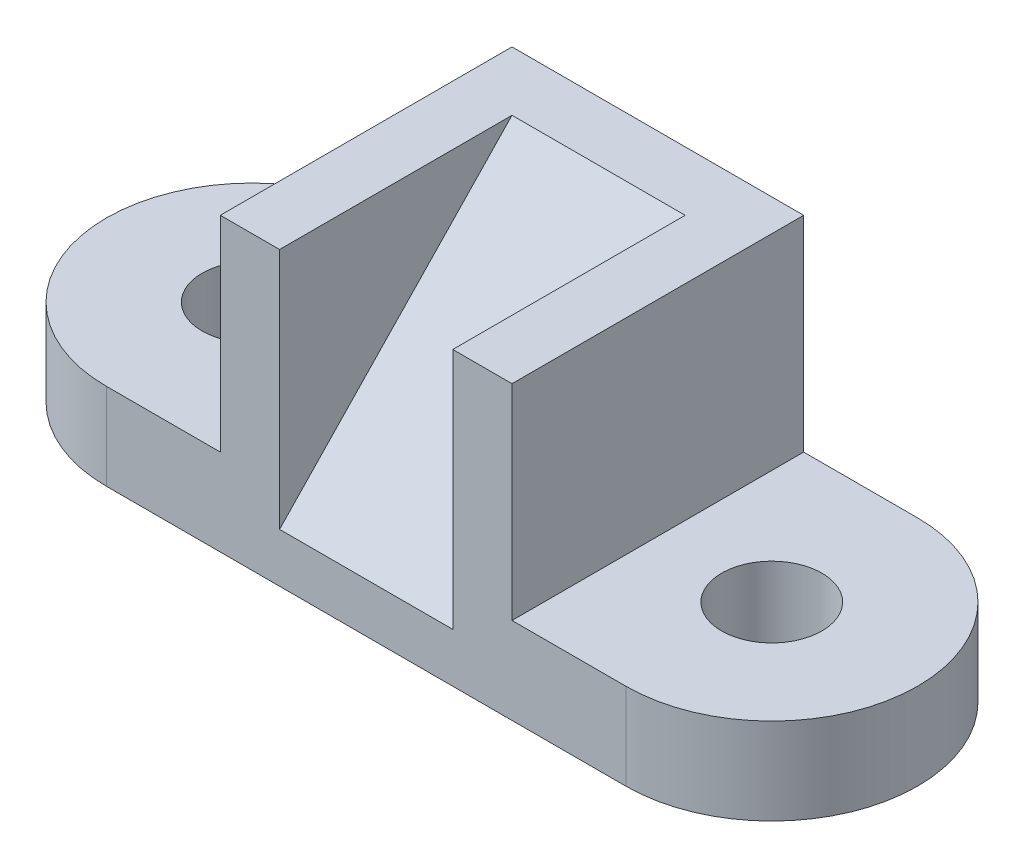
ISO-10303-21;
HEADER;
FILE_DESCRIPTION(('STEP AP214'),'2;1');
FILE_NAME('part.step','',(''),(''),'','','');
FILE_SCHEMA(('AUTOMOTIVE_DESIGN { 1 0 10303 214 1 1 1 1 }'));
ENDSEC;
DATA;
#1=APPLICATION_CONTEXT('core data for automotive mechanical design processes');
#2=APPLICATION_PROTOCOL_DEFINITION('international standard','automotive_design',2000,#1);
#3=PRODUCT_CONTEXT('',#1,'mechanical');
#4=PRODUCT('Part','Part','',(#3));
#5=PRODUCT_RELATED_PRODUCT_CATEGORY('part','',(#4));
#6=PRODUCT_DEFINITION_FORMATION('','',#4);
#7=PRODUCT_DEFINITION_CONTEXT('part definition',#1,'design');
#8=PRODUCT_DEFINITION('design','',#6,#7);
#9=PRODUCT_DEFINITION_SHAPE('','',#8);
#10=(LENGTH_UNIT() NAMED_UNIT(*) SI_UNIT(.MILLI.,.METRE.));
#11=(NAMED_UNIT(*) PLANE_ANGLE_UNIT() SI_UNIT($,.RADIAN.));
#12=(NAMED_UNIT(*) SI_UNIT($,.STERADIAN.) SOLID_ANGLE_UNIT());
#13=UNCERTAINTY_MEASURE_WITH_UNIT(LENGTH_MEASURE(1.E-05),#10,'distance_accuracy_value','');
#14=(GEOMETRIC_REPRESENTATION_CONTEXT(3) GLOBAL_UNCERTAINTY_ASSIGNED_CONTEXT((#13)) GLOBAL_UNIT_ASSIGNED_CONTEXT((#10,
#11,#12)) REPRESENTATION_CONTEXT('',''));
#15=CARTESIAN_POINT('',(0.,0.,0.));
#16=DIRECTION('',(0.,0.,1.));
#17=DIRECTION('',(1.,0.,0.));
#18=AXIS2_PLACEMENT_3D('',#15,#16,#17);
#19=CARTESIAN_POINT('',(-57.,19.,32.));
#20=DIRECTION('',(0.,0.,-1.));
#21=DIRECTION('',(-1.,0.,0.));
#22=AXIS2_PLACEMENT_3D('',#19,#20,#21);
#23=PLANE('',#22);
#24=DIRECTION('',(0.,1.,0.));
#25=VECTOR('',#24,1.);
#26=CARTESIAN_POINT('',(19.,10.8133361636676,32.));
#27=LINE('',#26,#25);
#28=CARTESIAN_POINT('',(19.,10.8133361636676,32.));
#29=VERTEX_POINT('',#28);
#30=CARTESIAN_POINT('',(19.,64.,32.));
#31=VERTEX_POINT('',#30);
#32=EDGE_CURVE('E124',#29,#31,#27,.T.);
#33=ORIENTED_EDGE('',*,*,#32,.F.);
#34=DIRECTION('',(-1.,0.,0.));
#35=VECTOR('',#34,1.);
#36=CARTESIAN_POINT('',(19.,10.8133361636676,32.));
#37=LINE('',#36,#35);
#38=CARTESIAN_POINT('',(-19.,10.8133361636676,32.));
#39=VERTEX_POINT('',#38);
#40=EDGE_CURVE('E160',#29,#39,#37,.T.);
#41=ORIENTED_EDGE('',*,*,#40,.T.);
#42=DIRECTION('',(0.,1.,0.));
#43=VECTOR('',#42,1.);
#44=CARTESIAN_POINT('',(-19.,10.8133361636676,32.));
#45=LINE('',#44,#43);
#46=CARTESIAN_POINT('',(-19.,64.,32.));
#47=VERTEX_POINT('',#46);
#48=EDGE_CURVE('E359',#39,#47,#45,.T.);
#49=ORIENTED_EDGE('',*,*,#48,.T.);
#50=DIRECTION('',(1.,0.,0.));
#51=VECTOR('',#50,1.);
#52=CARTESIAN_POINT('',(-32.,64.,32.));
#53=LINE('',#52,#51);
#54=CARTESIAN_POINT('',(-32.,64.,32.));
#55=VERTEX_POINT('',#54);
#56=EDGE_CURVE('E143',#55,#47,#53,.T.);
#57=ORIENTED_EDGE('',*,*,#56,.F.);
#58=DIRECTION('',(0.,-1.,0.));
#59=VECTOR('',#58,1.);
#60=CARTESIAN_POINT('',(-32.,64.,32.));
#61=LINE('',#60,#59);
#62=CARTESIAN_POINT('',(-32.,19.,32.));
#63=VERTEX_POINT('',#62);
#64=EDGE_CURVE('E159',#55,#63,#61,.T.);
#65=ORIENTED_EDGE('',*,*,#64,.T.);
#66=DIRECTION('',(1.,0.,0.));
#67=VECTOR('',#66,1.);
#68=CARTESIAN_POINT('',(-57.,19.,32.));
#69=LINE('',#68,#67);
#70=CARTESIAN_POINT('',(-57.,19.,32.));
#71=VERTEX_POINT('',#70);
#72=EDGE_CURVE('E187',#71,#63,#69,.T.);
#73=ORIENTED_EDGE('',*,*,#72,.F.);
#74=DIRECTION('',(0.,-1.,0.));
#75=VECTOR('',#74,1.);
#76=CARTESIAN_POINT('',(-57.,19.,32.));
#77=LINE('',#76,#75);
#78=CARTESIAN_POINT('',(-57.,0.,32.));
#79=VERTEX_POINT('',#78);
#80=EDGE_CURVE('E11',#71,#79,#77,.T.);
#81=ORIENTED_EDGE('',*,*,#80,.T.);
#82=DIRECTION('',(1.,0.,0.));
#83=VECTOR('',#82,1.);
#84=CARTESIAN_POINT('',(-57.,0.,32.));
#85=LINE('',#84,#83);
#86=CARTESIAN_POINT('',(57.,0.,32.));
#87=VERTEX_POINT('',#86);
#88=EDGE_CURVE('E199',#79,#87,#85,.T.);
#89=ORIENTED_EDGE('',*,*,#88,.T.);
#90=DIRECTION('',(0.,-1.,0.));
#91=VECTOR('',#90,1.);
#92=CARTESIAN_POINT('',(57.,19.,32.));
#93=LINE('',#92,#91);
#94=CARTESIAN_POINT('',(57.,19.,32.));
#95=VERTEX_POINT('',#94);
#96=EDGE_CURVE('E47',#95,#87,#93,.T.);
#97=ORIENTED_EDGE('',*,*,#96,.F.);
#98=CARTESIAN_POINT('',(32.,19.,32.));
#99=VERTEX_POINT('',#98);
#100=EDGE_CURVE('E185',#99,#95,#69,.T.);
#101=ORIENTED_EDGE('',*,*,#100,.F.);
#102=DIRECTION('',(0.,-1.,0.));
#103=VECTOR('',#102,1.);
#104=CARTESIAN_POINT('',(32.,64.,32.));
#105=LINE('',#104,#103);
#106=CARTESIAN_POINT('',(32.,64.,32.));
#107=VERTEX_POINT('',#106);
#108=EDGE_CURVE('E62',#107,#99,#105,.T.);
#109=ORIENTED_EDGE('',*,*,#108,.F.);
#110=EDGE_CURVE('E138',#31,#107,#53,.T.);
#111=ORIENTED_EDGE('',*,*,#110,.F.);
#112=EDGE_LOOP('',(#33,#41,#49,#57,#65,#73,#81,#89,#97,#101,#109,#111));
#113=FACE_BOUND('',#112,.T.);
#114=ADVANCED_FACE('F39',(#113),#23,.F.);
#115=CARTESIAN_POINT('',(0.,64.,0.));
#116=DIRECTION('',(0.,-1.,0.));
#117=DIRECTION('',(0.,0.,-1.));
#118=AXIS2_PLACEMENT_3D('',#115,#116,#117);
#119=PLANE('',#118);
#120=DIRECTION('',(0.,0.,-1.));
#121=VECTOR('',#120,1.);
#122=CARTESIAN_POINT('',(19.,64.,32.));
#123=LINE('',#122,#121);
#124=CARTESIAN_POINT('',(19.,64.,-19.));
#125=VERTEX_POINT('',#124);
#126=EDGE_CURVE('E127',#31,#125,#123,.T.);
#127=ORIENTED_EDGE('',*,*,#126,.F.);
#128=ORIENTED_EDGE('',*,*,#110,.T.);
#129=DIRECTION('',(0.,0.,1.));
#130=VECTOR('',#129,1.);
#131=CARTESIAN_POINT('',(32.,64.,-32.));
#132=LINE('',#131,#130);
#133=CARTESIAN_POINT('',(32.,64.,-32.));
#134=VERTEX_POINT('',#133);
#135=EDGE_CURVE('E147',#134,#107,#132,.T.);
#136=ORIENTED_EDGE('',*,*,#135,.F.);
#137=DIRECTION('',(1.,0.,0.));
#138=VECTOR('',#137,1.);
#139=CARTESIAN_POINT('',(-32.,64.,-32.));
#140=LINE('',#139,#138);
#141=CARTESIAN_POINT('',(-32.,64.,-32.));
#142=VERTEX_POINT('',#141);
#143=EDGE_CURVE('E154',#142,#134,#140,.T.);
#144=ORIENTED_EDGE('',*,*,#143,.F.);
#145=DIRECTION('',(0.,0.,1.));
#146=VECTOR('',#145,1.);
#147=CARTESIAN_POINT('',(-32.,64.,-32.));
#148=LINE('',#147,#146);
#149=EDGE_CURVE('E157',#142,#55,#148,.T.);
#150=ORIENTED_EDGE('',*,*,#149,.T.);
#151=ORIENTED_EDGE('',*,*,#56,.T.);
#152=DIRECTION('',(0.,0.,-1.));
#153=VECTOR('',#152,1.);
#154=CARTESIAN_POINT('',(-19.,64.,32.));
#155=LINE('',#154,#153);
#156=CARTESIAN_POINT('',(-19.,64.,-19.));
#157=VERTEX_POINT('',#156);
#158=EDGE_CURVE('E360',#47,#157,#155,.T.);
#159=ORIENTED_EDGE('',*,*,#158,.T.);
#160=DIRECTION('',(-1.,0.,0.));
#161=VECTOR('',#160,1.);
#162=CARTESIAN_POINT('',(19.,64.,-19.));
#163=LINE('',#162,#161);
#164=EDGE_CURVE('E140',#125,#157,#163,.T.);
#165=ORIENTED_EDGE('',*,*,#164,.F.);
#166=EDGE_LOOP('',(#127,#128,#136,#144,#150,#151,#159,#165));
#167=FACE_BOUND('',#166,.T.);
#168=ADVANCED_FACE('F136',(#167),#119,.F.);
#169=CARTESIAN_POINT('',(-57.,19.,0.));
#170=DIRECTION('',(0.,1.,0.));
#171=DIRECTION('',(0.,0.,1.));
#172=AXIS2_PLACEMENT_3D('',#169,#170,#171);
#173=PLANE('',#172);
#174=CARTESIAN_POINT('',(57.,19.,0.));
#175=DIRECTION('',(0.,1.,0.));
#176=DIRECTION('',(0.,0.,1.));
#177=AXIS2_PLACEMENT_3D('',#174,#175,#176);
#178=CIRCLE('',#177,11.);
#179=CARTESIAN_POINT('',(57.,19.,11.));
#180=VERTEX_POINT('',#179);
#181=EDGE_CURVE('E170',#180,#180,#178,.T.);
#182=ORIENTED_EDGE('',*,*,#181,.F.);
#183=EDGE_LOOP('',(#182));
#184=FACE_BOUND('',#183,.T.);
#185=DIRECTION('',(-1.,0.,0.));
#186=VECTOR('',#185,1.);
#187=CARTESIAN_POINT('',(-57.,19.,-32.));
#188=LINE('',#187,#186);
#189=CARTESIAN_POINT('',(57.,19.,-32.));
#190=VERTEX_POINT('',#189);
#191=CARTESIAN_POINT('',(32.,19.,-32.));
#192=VERTEX_POINT('',#191);
#193=EDGE_CURVE('E193',#190,#192,#188,.T.);
#194=ORIENTED_EDGE('',*,*,#193,.T.);
#195=DIRECTION('',(0.,0.,1.));
#196=VECTOR('',#195,1.);
#197=CARTESIAN_POINT('',(32.,19.,-32.));
#198=LINE('',#197,#196);
#199=EDGE_CURVE('E148',#192,#99,#198,.T.);
#200=ORIENTED_EDGE('',*,*,#199,.T.);
#201=ORIENTED_EDGE('',*,*,#100,.T.);
#202=CARTESIAN_POINT('',(57.,19.,0.));
#203=DIRECTION('',(0.,1.,0.));
#204=DIRECTION('',(0.,0.,1.));
#205=AXIS2_PLACEMENT_3D('',#202,#203,#204);
#206=CIRCLE('',#205,32.);
#207=EDGE_CURVE('E190',#95,#190,#206,.T.);
#208=ORIENTED_EDGE('',*,*,#207,.T.);
#209=EDGE_LOOP('',(#194,#200,#201,#208));
#210=FACE_BOUND('',#209,.T.);
#211=ADVANCED_FACE('F240',(#184,#210),#173,.T.);
#212=DIRECTION('',(0.,0.,1.));
#213=VECTOR('',#212,1.);
#214=CARTESIAN_POINT('',(-32.,19.,-32.));
#215=LINE('',#214,#213);
#216=CARTESIAN_POINT('',(-32.,19.,-32.));
#217=VERTEX_POINT('',#216);
#218=EDGE_CURVE('E144',#217,#63,#215,.T.);
#219=ORIENTED_EDGE('',*,*,#218,.F.);
#220=CARTESIAN_POINT('',(-57.,19.,-32.));
#221=VERTEX_POINT('',#220);
#222=EDGE_CURVE('E192',#217,#221,#188,.T.);
#223=ORIENTED_EDGE('',*,*,#222,.T.);
#224=CARTESIAN_POINT('',(-57.,19.,0.));
#225=DIRECTION('',(0.,1.,0.));
#226=DIRECTION('',(0.,0.,1.));
#227=AXIS2_PLACEMENT_3D('',#224,#225,#226);
#228=CIRCLE('',#227,32.);
#229=EDGE_CURVE('E182',#221,#71,#228,.T.);
#230=ORIENTED_EDGE('',*,*,#229,.T.);
#231=ORIENTED_EDGE('',*,*,#72,.T.);
#232=EDGE_LOOP('',(#219,#223,#230,#231));
#233=FACE_BOUND('',#232,.T.);
#234=CARTESIAN_POINT('',(-57.,19.,0.));
#235=DIRECTION('',(0.,1.,0.));
#236=DIRECTION('',(0.,0.,1.));
#237=AXIS2_PLACEMENT_3D('',#234,#235,#236);
#238=CIRCLE('',#237,11.);
#239=CARTESIAN_POINT('',(-57.,19.,11.));
#240=VERTEX_POINT('',#239);
#241=EDGE_CURVE('E176',#240,#240,#238,.T.);
#242=ORIENTED_EDGE('',*,*,#241,.F.);
#243=EDGE_LOOP('',(#242));
#244=FACE_BOUND('',#243,.T.);
#245=ADVANCED_FACE('F230',(#233,#244),#173,.T.);
#246=CARTESIAN_POINT('',(-57.,0.,0.));
#247=DIRECTION('',(0.,1.,0.));
#248=DIRECTION('',(0.,0.,1.));
#249=AXIS2_PLACEMENT_3D('',#246,#247,#248);
#250=PLANE('',#249);
#251=CARTESIAN_POINT('',(-57.,0.,0.));
#252=DIRECTION('',(0.,1.,0.));
#253=DIRECTION('',(0.,0.,1.));
#254=AXIS2_PLACEMENT_3D('',#251,#252,#253);
#255=CIRCLE('',#254,32.);
#256=CARTESIAN_POINT('',(-57.,0.,-32.));
#257=VERTEX_POINT('',#256);
#258=EDGE_CURVE('E179',#257,#79,#255,.T.);
#259=ORIENTED_EDGE('',*,*,#258,.F.);
#260=DIRECTION('',(-1.,0.,0.));
#261=VECTOR('',#260,1.);
#262=CARTESIAN_POINT('',(-57.,0.,-32.));
#263=LINE('',#262,#261);
#264=CARTESIAN_POINT('',(57.,0.,-32.));
#265=VERTEX_POINT('',#264);
#266=EDGE_CURVE('E186',#265,#257,#263,.T.);
#267=ORIENTED_EDGE('',*,*,#266,.F.);
#268=CARTESIAN_POINT('',(57.,0.,0.));
#269=DIRECTION('',(0.,1.,0.));
#270=DIRECTION('',(0.,0.,1.));
#271=AXIS2_PLACEMENT_3D('',#268,#269,#270);
#272=CIRCLE('',#271,32.);
#273=EDGE_CURVE('E201',#87,#265,#272,.T.);
#274=ORIENTED_EDGE('',*,*,#273,.F.);
#275=ORIENTED_EDGE('',*,*,#88,.F.);
#276=EDGE_LOOP('',(#259,#267,#274,#275));
#277=FACE_BOUND('',#276,.T.);
#278=CARTESIAN_POINT('',(-57.,0.,0.));
#279=DIRECTION('',(0.,1.,0.));
#280=DIRECTION('',(0.,0.,1.));
#281=AXIS2_PLACEMENT_3D('',#278,#279,#280);
#282=CIRCLE('',#281,11.);
#283=CARTESIAN_POINT('',(-57.,0.,11.));
#284=VERTEX_POINT('',#283);
#285=EDGE_CURVE('E173',#284,#284,#282,.T.);
#286=ORIENTED_EDGE('',*,*,#285,.T.);
#287=EDGE_LOOP('',(#286));
#288=FACE_BOUND('',#287,.T.);
#289=CARTESIAN_POINT('',(57.,0.,0.));
#290=DIRECTION('',(0.,1.,0.));
#291=DIRECTION('',(0.,0.,1.));
#292=AXIS2_PLACEMENT_3D('',#289,#290,#291);
#293=CIRCLE('',#292,11.);
#294=CARTESIAN_POINT('',(57.,0.,11.));
#295=VERTEX_POINT('',#294);
#296=EDGE_CURVE('E169',#295,#295,#293,.T.);
#297=ORIENTED_EDGE('',*,*,#296,.T.);
#298=EDGE_LOOP('',(#297));
#299=FACE_BOUND('',#298,.T.);
#300=ADVANCED_FACE('F218',(#277,#288,#299),#250,.F.);
#301=CARTESIAN_POINT('',(-57.,19.,0.));
#302=DIRECTION('',(0.,-1.,0.));
#303=DIRECTION('',(0.,0.,-1.));
#304=AXIS2_PLACEMENT_3D('',#301,#302,#303);
#305=CYLINDRICAL_SURFACE('',#304,32.);
#306=ORIENTED_EDGE('',*,*,#258,.T.);
#307=ORIENTED_EDGE('',*,*,#80,.F.);
#308=ORIENTED_EDGE('',*,*,#229,.F.);
#309=DIRECTION('',(0.,-1.,0.));
#310=VECTOR('',#309,1.);
#311=CARTESIAN_POINT('',(-57.,19.,-32.));
#312=LINE('',#311,#310);
#313=EDGE_CURVE('E196',#221,#257,#312,.T.);
#314=ORIENTED_EDGE('',*,*,#313,.T.);
#315=EDGE_LOOP('',(#306,#307,#308,#314));
#316=FACE_BOUND('',#315,.T.);
#317=ADVANCED_FACE('F41',(#316),#305,.T.);
#318=CARTESIAN_POINT('',(57.,19.,0.));
#319=DIRECTION('',(0.,-1.,0.));
#320=DIRECTION('',(0.,0.,-1.));
#321=AXIS2_PLACEMENT_3D('',#318,#319,#320);
#322=CYLINDRICAL_SURFACE('',#321,32.);
#323=ORIENTED_EDGE('',*,*,#273,.T.);
#324=DIRECTION('',(0.,-1.,0.));
#325=VECTOR('',#324,1.);
#326=CARTESIAN_POINT('',(57.,19.,-32.));
#327=LINE('',#326,#325);
#328=EDGE_CURVE('E206',#190,#265,#327,.T.);
#329=ORIENTED_EDGE('',*,*,#328,.F.);
#330=ORIENTED_EDGE('',*,*,#207,.F.);
#331=ORIENTED_EDGE('',*,*,#96,.T.);
#332=EDGE_LOOP('',(#323,#329,#330,#331));
#333=FACE_BOUND('',#332,.T.);
#334=ADVANCED_FACE('F213',(#333),#322,.T.);
#335=CARTESIAN_POINT('',(-57.,19.,-32.));
#336=DIRECTION('',(0.,0.,1.));
#337=DIRECTION('',(1.,0.,0.));
#338=AXIS2_PLACEMENT_3D('',#335,#336,#337);
#339=PLANE('',#338);
#340=ORIENTED_EDGE('',*,*,#266,.T.);
#341=ORIENTED_EDGE('',*,*,#313,.F.);
#342=ORIENTED_EDGE('',*,*,#222,.F.);
#343=DIRECTION('',(0.,-1.,0.));
#344=VECTOR('',#343,1.);
#345=CARTESIAN_POINT('',(-32.,64.,-32.));
#346=LINE('',#345,#344);
#347=EDGE_CURVE('E164',#142,#217,#346,.T.);
#348=ORIENTED_EDGE('',*,*,#347,.F.);
#349=ORIENTED_EDGE('',*,*,#143,.T.);
#350=DIRECTION('',(0.,-1.,0.));
#351=VECTOR('',#350,1.);
#352=CARTESIAN_POINT('',(32.,64.,-32.));
#353=LINE('',#352,#351);
#354=EDGE_CURVE('E166',#134,#192,#353,.T.);
#355=ORIENTED_EDGE('',*,*,#354,.T.);
#356=ORIENTED_EDGE('',*,*,#193,.F.);
#357=ORIENTED_EDGE('',*,*,#328,.T.);
#358=EDGE_LOOP('',(#340,#341,#342,#348,#349,#355,#356,#357));
#359=FACE_BOUND('',#358,.T.);
#360=ADVANCED_FACE('F222',(#359),#339,.F.);
#361=CARTESIAN_POINT('',(-57.,19.,0.));
#362=DIRECTION('',(0.,-1.,0.));
#363=DIRECTION('',(0.,0.,-1.));
#364=AXIS2_PLACEMENT_3D('',#361,#362,#363);
#365=CYLINDRICAL_SURFACE('',#364,11.);
#366=ORIENTED_EDGE('',*,*,#241,.T.);
#367=EDGE_LOOP('',(#366));
#368=FACE_BOUND('',#367,.T.);
#369=ORIENTED_EDGE('',*,*,#285,.F.);
#370=EDGE_LOOP('',(#369));
#371=FACE_BOUND('',#370,.T.);
#372=ADVANCED_FACE('F261',(#368,#371),#365,.F.);
#373=CARTESIAN_POINT('',(57.,19.,0.));
#374=DIRECTION('',(0.,-1.,0.));
#375=DIRECTION('',(0.,0.,-1.));
#376=AXIS2_PLACEMENT_3D('',#373,#374,#375);
#377=CYLINDRICAL_SURFACE('',#376,11.);
#378=ORIENTED_EDGE('',*,*,#181,.T.);
#379=EDGE_LOOP('',(#378));
#380=FACE_BOUND('',#379,.T.);
#381=ORIENTED_EDGE('',*,*,#296,.F.);
#382=EDGE_LOOP('',(#381));
#383=FACE_BOUND('',#382,.T.);
#384=ADVANCED_FACE('F280',(#380,#383),#377,.F.);
#385=CARTESIAN_POINT('',(32.,64.,-32.));
#386=DIRECTION('',(1.,0.,0.));
#387=DIRECTION('',(0.,0.,-1.));
#388=AXIS2_PLACEMENT_3D('',#385,#386,#387);
#389=PLANE('',#388);
#390=ORIENTED_EDGE('',*,*,#199,.F.);
#391=ORIENTED_EDGE('',*,*,#354,.F.);
#392=ORIENTED_EDGE('',*,*,#135,.T.);
#393=ORIENTED_EDGE('',*,*,#108,.T.);
#394=EDGE_LOOP('',(#390,#391,#392,#393));
#395=FACE_BOUND('',#394,.T.);
#396=ADVANCED_FACE('F238',(#395),#389,.T.);
#397=CARTESIAN_POINT('',(-32.,64.,-32.));
#398=DIRECTION('',(1.,0.,0.));
#399=DIRECTION('',(0.,0.,-1.));
#400=AXIS2_PLACEMENT_3D('',#397,#398,#399);
#401=PLANE('',#400);
#402=ORIENTED_EDGE('',*,*,#218,.T.);
#403=ORIENTED_EDGE('',*,*,#64,.F.);
#404=ORIENTED_EDGE('',*,*,#149,.F.);
#405=ORIENTED_EDGE('',*,*,#347,.T.);
#406=EDGE_LOOP('',(#402,#403,#404,#405));
#407=FACE_BOUND('',#406,.T.);
#408=ADVANCED_FACE('F236',(#407),#401,.F.);
#409=CARTESIAN_POINT('',(19.,64.,-19.));
#410=DIRECTION('',(0.,-0.69211364476813,-0.72178854432983));
#411=DIRECTION('',(0.,0.72178854432983,-0.69211364476813));
#412=AXIS2_PLACEMENT_3D('',#409,#410,#411);
#413=PLANE('',#412);
#414=DIRECTION('',(0.,-0.72178854432983,0.69211364476813));
#415=VECTOR('',#414,1.);
#416=CARTESIAN_POINT('',(-19.,64.,-19.));
#417=LINE('',#416,#415);
#418=EDGE_CURVE('E54',#157,#39,#417,.T.);
#419=ORIENTED_EDGE('',*,*,#418,.T.);
#420=ORIENTED_EDGE('',*,*,#40,.F.);
#421=DIRECTION('',(0.,-0.72178854432983,0.69211364476813));
#422=VECTOR('',#421,1.);
#423=CARTESIAN_POINT('',(19.,64.,-19.));
#424=LINE('',#423,#422);
#425=EDGE_CURVE('E129',#125,#29,#424,.T.);
#426=ORIENTED_EDGE('',*,*,#425,.F.);
#427=ORIENTED_EDGE('',*,*,#164,.T.);
#428=EDGE_LOOP('',(#419,#420,#426,#427));
#429=FACE_BOUND('',#428,.T.);
#430=ADVANCED_FACE('F317',(#429),#413,.F.);
#431=CARTESIAN_POINT('',(19.,0.,0.));
#432=DIRECTION('',(-1.,0.,0.));
#433=DIRECTION('',(0.,0.,1.));
#434=AXIS2_PLACEMENT_3D('',#431,#432,#433);
#435=PLANE('',#434);
#436=ORIENTED_EDGE('',*,*,#32,.T.);
#437=ORIENTED_EDGE('',*,*,#126,.T.);
#438=ORIENTED_EDGE('',*,*,#425,.T.);
#439=EDGE_LOOP('',(#436,#437,#438));
#440=FACE_BOUND('',#439,.T.);
#441=ADVANCED_FACE('F126',(#440),#435,.T.);
#442=CARTESIAN_POINT('',(-19.,0.,0.));
#443=DIRECTION('',(-1.,0.,0.));
#444=DIRECTION('',(0.,0.,1.));
#445=AXIS2_PLACEMENT_3D('',#442,#443,#444);
#446=PLANE('',#445);
#447=ORIENTED_EDGE('',*,*,#48,.F.);
#448=ORIENTED_EDGE('',*,*,#418,.F.);
#449=ORIENTED_EDGE('',*,*,#158,.F.);
#450=EDGE_LOOP('',(#447,#448,#449));
#451=FACE_BOUND('',#450,.T.);
#452=ADVANCED_FACE('F347',(#451),#446,.F.);
#453=CLOSED_SHELL('',(#114,#168,#211,#245,#300,#317,#334,#360,#372,#384,#396,#408,#430,#441,#452));
#454=MANIFOLD_SOLID_BREP('B2',#453);
#455=ADVANCED_BREP_SHAPE_REPRESENTATION('',(#18,#454),#14);
#456=SHAPE_DEFINITION_REPRESENTATION(#9,#455);
ENDSEC;
END-ISO-10303-21;
